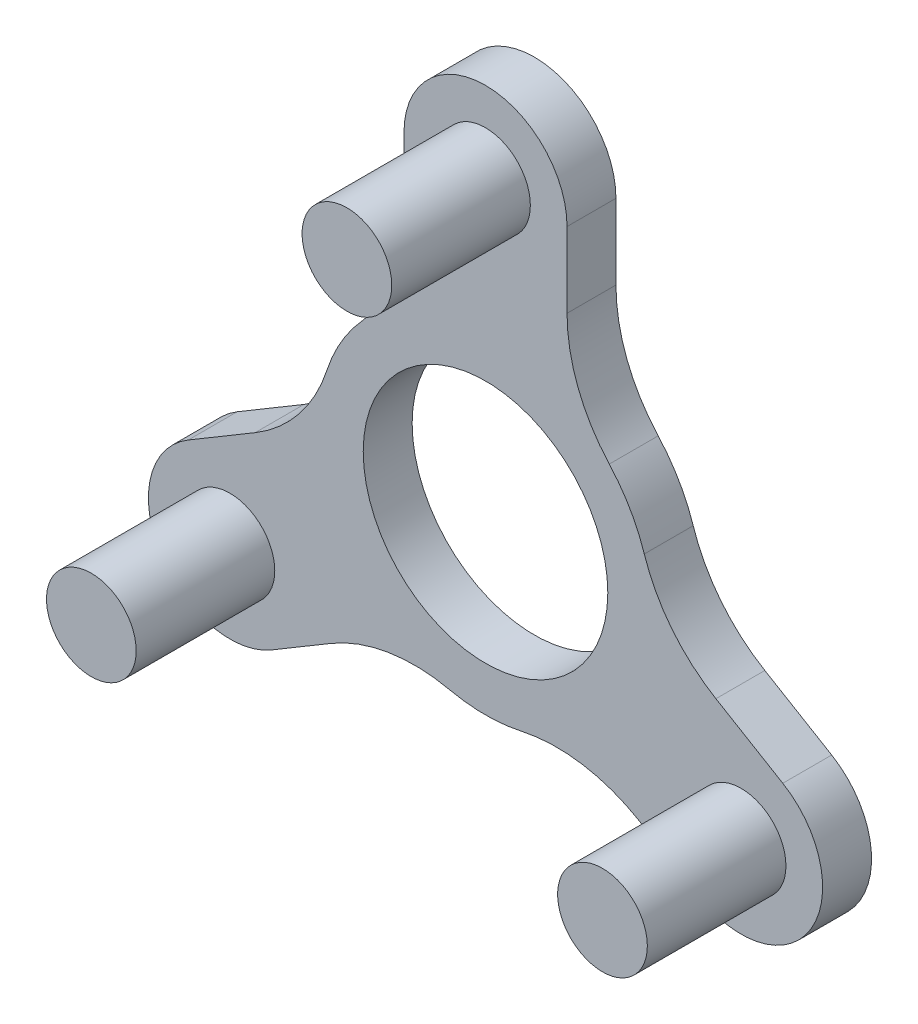
ISO-10303-21;
HEADER;
FILE_DESCRIPTION(('STEP AP214'),'2;1');
FILE_NAME('part.step','',(''),(''),'','','');
FILE_SCHEMA(('AUTOMOTIVE_DESIGN { 1 0 10303 214 1 1 1 1 }'));
ENDSEC;
DATA;
#1=APPLICATION_CONTEXT('core data for automotive mechanical design processes');
#2=APPLICATION_PROTOCOL_DEFINITION('international standard','automotive_design',2000,#1);
#3=PRODUCT_CONTEXT('',#1,'mechanical');
#4=PRODUCT('Part','Part','',(#3));
#5=PRODUCT_RELATED_PRODUCT_CATEGORY('part','',(#4));
#6=PRODUCT_DEFINITION_FORMATION('','',#4);
#7=PRODUCT_DEFINITION_CONTEXT('part definition',#1,'design');
#8=PRODUCT_DEFINITION('design','',#6,#7);
#9=PRODUCT_DEFINITION_SHAPE('','',#8);
#10=(LENGTH_UNIT() NAMED_UNIT(*) SI_UNIT(.MILLI.,.METRE.));
#11=(NAMED_UNIT(*) PLANE_ANGLE_UNIT() SI_UNIT($,.RADIAN.));
#12=(NAMED_UNIT(*) SI_UNIT($,.STERADIAN.) SOLID_ANGLE_UNIT());
#13=UNCERTAINTY_MEASURE_WITH_UNIT(LENGTH_MEASURE(1.E-05),#10,'distance_accuracy_value','');
#14=(GEOMETRIC_REPRESENTATION_CONTEXT(3) GLOBAL_UNCERTAINTY_ASSIGNED_CONTEXT((#13)) GLOBAL_UNIT_ASSIGNED_CONTEXT((#10,
#11,#12)) REPRESENTATION_CONTEXT('',''));
#15=CARTESIAN_POINT('',(0.,0.,0.));
#16=DIRECTION('',(0.,0.,1.));
#17=DIRECTION('',(1.,0.,0.));
#18=AXIS2_PLACEMENT_3D('',#15,#16,#17);
#19=CARTESIAN_POINT('',(-15.6750598084983,-9.05000000000008,3.));
#20=DIRECTION('',(0.,0.,-1.));
#21=DIRECTION('',(-1.,0.,0.));
#22=AXIS2_PLACEMENT_3D('',#19,#20,#21);
#23=CYLINDRICAL_SURFACE('',#22,5.);
#24=CARTESIAN_POINT('',(-15.6750598084983,-9.05000000000008,0.));
#25=DIRECTION('',(0.,0.,1.));
#26=DIRECTION('',(1.,0.,0.));
#27=AXIS2_PLACEMENT_3D('',#24,#25,#26);
#28=CIRCLE('',#27,5.);
#29=CARTESIAN_POINT('',(-18.2317713929619,-4.75311439832654,0.));
#30=VERTEX_POINT('',#29);
#31=CARTESIAN_POINT('',(-13.1183482240346,-13.3468856016736,0.));
#32=VERTEX_POINT('',#31);
#33=EDGE_CURVE('E255',#30,#32,#28,.T.);
#34=ORIENTED_EDGE('',*,*,#33,.T.);
#35=DIRECTION('',(0.,0.,-1.));
#36=VECTOR('',#35,1.);
#37=CARTESIAN_POINT('',(-13.1183482240346,-13.3468856016736,3.));
#38=LINE('',#37,#36);
#39=CARTESIAN_POINT('',(-13.1183482240346,-13.3468856016736,3.));
#40=VERTEX_POINT('',#39);
#41=EDGE_CURVE('E211',#40,#32,#38,.T.);
#42=ORIENTED_EDGE('',*,*,#41,.F.);
#43=CARTESIAN_POINT('',(-15.6750598084983,-9.05000000000008,3.));
#44=DIRECTION('',(0.,0.,1.));
#45=DIRECTION('',(1.,0.,0.));
#46=AXIS2_PLACEMENT_3D('',#43,#44,#45);
#47=CIRCLE('',#46,5.);
#48=CARTESIAN_POINT('',(-18.2317713929619,-4.75311439832654,3.));
#49=VERTEX_POINT('',#48);
#50=EDGE_CURVE('E214',#49,#40,#47,.T.);
#51=ORIENTED_EDGE('',*,*,#50,.F.);
#52=DIRECTION('',(0.,0.,-1.));
#53=VECTOR('',#52,1.);
#54=CARTESIAN_POINT('',(-18.2317713929619,-4.75311439832654,3.));
#55=LINE('',#54,#53);
#56=EDGE_CURVE('E199',#49,#30,#55,.T.);
#57=ORIENTED_EDGE('',*,*,#56,.T.);
#58=EDGE_LOOP('',(#34,#42,#51,#57));
#59=FACE_BOUND('',#58,.T.);
#60=ADVANCED_FACE('F74',(#59),#23,.T.);
#61=CARTESIAN_POINT('',(2.43503335375282,-4.09238954480285,3.));
#62=DIRECTION('',(-0.511342316892728,0.859377120334709,0.));
#63=DIRECTION('',(-0.859377120334709,-0.511342316892728,0.));
#64=AXIS2_PLACEMENT_3D('',#61,#62,#63);
#65=PLANE('',#64);
#66=DIRECTION('',(0.859377120334709,0.511342316892728,0.));
#67=VECTOR('',#66,1.);
#68=CARTESIAN_POINT('',(2.43503335375282,-4.09238954480285,0.));
#69=LINE('',#68,#67);
#70=CARTESIAN_POINT('',(-9.46922520496294,-11.1756025001734,0.));
#71=VERTEX_POINT('',#70);
#72=EDGE_CURVE('E258',#32,#71,#69,.T.);
#73=ORIENTED_EDGE('',*,*,#72,.T.);
#74=DIRECTION('',(0.,0.,1.));
#75=VECTOR('',#74,1.);
#76=CARTESIAN_POINT('',(-9.46922520496294,-11.1756025001734,3.));
#77=LINE('',#76,#75);
#78=CARTESIAN_POINT('',(-9.46922520496294,-11.1756025001734,3.));
#79=VERTEX_POINT('',#78);
#80=EDGE_CURVE('E89',#71,#79,#77,.T.);
#81=ORIENTED_EDGE('',*,*,#80,.T.);
#82=DIRECTION('',(0.859377120334709,0.511342316892728,0.));
#83=VECTOR('',#82,1.);
#84=CARTESIAN_POINT('',(2.43503335375282,-4.09238954480285,3.));
#85=LINE('',#84,#83);
#86=EDGE_CURVE('E217',#40,#79,#85,.T.);
#87=ORIENTED_EDGE('',*,*,#86,.F.);
#88=ORIENTED_EDGE('',*,*,#41,.T.);
#89=EDGE_LOOP('',(#73,#81,#87,#88));
#90=FACE_BOUND('',#89,.T.);
#91=ADVANCED_FACE('F353',(#90),#65,.F.);
#92=CARTESIAN_POINT('',(0.,0.,3.));
#93=DIRECTION('',(0.,0.,-1.));
#94=DIRECTION('',(-1.,0.,0.));
#95=AXIS2_PLACEMENT_3D('',#92,#93,#94);
#96=CYLINDRICAL_SURFACE('',#95,10.2435458358109);
#97=CARTESIAN_POINT('',(0.,0.,0.));
#98=DIRECTION('',(0.,0.,1.));
#99=DIRECTION('',(1.,0.,0.));
#100=AXIS2_PLACEMENT_3D('',#97,#98,#99);
#101=CIRCLE('',#100,10.2435458358109);
#102=CARTESIAN_POINT('',(-2.20410288640831,-10.0036074371442,0.));
#103=VERTEX_POINT('',#102);
#104=CARTESIAN_POINT('',(2.20410288640832,-10.0036074371442,0.));
#105=VERTEX_POINT('',#104);
#106=EDGE_CURVE('E229',#103,#105,#101,.T.);
#107=ORIENTED_EDGE('',*,*,#106,.T.);
#108=DIRECTION('',(0.,0.,-1.));
#109=VECTOR('',#108,1.);
#110=CARTESIAN_POINT('',(2.20410288640832,-10.0036074371442,3.));
#111=LINE('',#110,#109);
#112=CARTESIAN_POINT('',(2.20410288640832,-10.0036074371442,3.));
#113=VERTEX_POINT('',#112);
#114=EDGE_CURVE('E292',#105,#113,#111,.F.);
#115=ORIENTED_EDGE('',*,*,#114,.T.);
#116=CARTESIAN_POINT('',(0.,0.,3.));
#117=DIRECTION('',(0.,0.,1.));
#118=DIRECTION('',(1.,0.,0.));
#119=AXIS2_PLACEMENT_3D('',#116,#117,#118);
#120=CIRCLE('',#119,10.2435458358109);
#121=CARTESIAN_POINT('',(-2.20410288640831,-10.0036074371442,3.));
#122=VERTEX_POINT('',#121);
#123=EDGE_CURVE('E235',#122,#113,#120,.T.);
#124=ORIENTED_EDGE('',*,*,#123,.F.);
#125=DIRECTION('',(0.,0.,-1.));
#126=VECTOR('',#125,1.);
#127=CARTESIAN_POINT('',(-2.20410288640831,-10.0036074371442,3.));
#128=LINE('',#127,#126);
#129=EDGE_CURVE('E289',#122,#103,#128,.T.);
#130=ORIENTED_EDGE('',*,*,#129,.T.);
#131=EDGE_LOOP('',(#107,#115,#124,#130));
#132=FACE_BOUND('',#131,.T.);
#133=ADVANCED_FACE('F358',(#132),#96,.T.);
#134=CARTESIAN_POINT('',(-2.43503335375282,-4.09238954480286,3.));
#135=DIRECTION('',(-0.511342316892728,-0.859377120334709,0.));
#136=DIRECTION('',(0.859377120334709,-0.511342316892728,0.));
#137=AXIS2_PLACEMENT_3D('',#134,#135,#136);
#138=PLANE('',#137);
#139=DIRECTION('',(-0.859377120334709,0.511342316892728,0.));
#140=VECTOR('',#139,1.);
#141=CARTESIAN_POINT('',(-2.43503335375282,-4.09238954480286,3.));
#142=LINE('',#141,#140);
#143=CARTESIAN_POINT('',(13.1183482240346,-13.3468856016736,3.));
#144=VERTEX_POINT('',#143);
#145=CARTESIAN_POINT('',(9.46922520496294,-11.1756025001734,3.));
#146=VERTEX_POINT('',#145);
#147=EDGE_CURVE('E241',#144,#146,#142,.T.);
#148=ORIENTED_EDGE('',*,*,#147,.T.);
#149=DIRECTION('',(0.,0.,-1.));
#150=VECTOR('',#149,1.);
#151=CARTESIAN_POINT('',(9.46922520496294,-11.1756025001734,3.));
#152=LINE('',#151,#150);
#153=CARTESIAN_POINT('',(9.46922520496294,-11.1756025001734,0.));
#154=VERTEX_POINT('',#153);
#155=EDGE_CURVE('E210',#146,#154,#152,.T.);
#156=ORIENTED_EDGE('',*,*,#155,.T.);
#157=DIRECTION('',(-0.859377120334709,0.511342316892728,0.));
#158=VECTOR('',#157,1.);
#159=CARTESIAN_POINT('',(-2.43503335375282,-4.09238954480286,0.));
#160=LINE('',#159,#158);
#161=CARTESIAN_POINT('',(13.1183482240346,-13.3468856016736,0.));
#162=VERTEX_POINT('',#161);
#163=EDGE_CURVE('E260',#162,#154,#160,.T.);
#164=ORIENTED_EDGE('',*,*,#163,.F.);
#165=DIRECTION('',(0.,0.,-1.));
#166=VECTOR('',#165,1.);
#167=CARTESIAN_POINT('',(13.1183482240346,-13.3468856016736,3.));
#168=LINE('',#167,#166);
#169=EDGE_CURVE('E279',#144,#162,#168,.T.);
#170=ORIENTED_EDGE('',*,*,#169,.F.);
#171=EDGE_LOOP('',(#148,#156,#164,#170));
#172=FACE_BOUND('',#171,.T.);
#173=ADVANCED_FACE('F416',(#172),#138,.T.);
#174=CARTESIAN_POINT('',(2.67838981517445,4.50138165854423,3.));
#175=DIRECTION('',(-0.511342316892728,-0.859377120334709,0.));
#176=DIRECTION('',(0.859377120334709,-0.511342316892728,0.));
#177=AXIS2_PLACEMENT_3D('',#174,#175,#176);
#178=PLANE('',#177);
#179=DIRECTION('',(-0.859377120334709,0.511342316892728,0.));
#180=VECTOR('',#179,1.);
#181=CARTESIAN_POINT('',(2.67838981517445,4.50138165854423,0.));
#182=LINE('',#181,#180);
#183=CARTESIAN_POINT('',(18.2317713929619,-4.75311439832654,0.));
#184=VERTEX_POINT('',#183);
#185=CARTESIAN_POINT('',(14.1312068435024,-2.31321679380084,0.));
#186=VERTEX_POINT('',#185);
#187=EDGE_CURVE('E263',#184,#186,#182,.T.);
#188=ORIENTED_EDGE('',*,*,#187,.T.);
#189=DIRECTION('',(0.,0.,1.));
#190=VECTOR('',#189,1.);
#191=CARTESIAN_POINT('',(14.1312068435024,-2.31321679380084,3.));
#192=LINE('',#191,#190);
#193=CARTESIAN_POINT('',(14.1312068435024,-2.31321679380084,3.));
#194=VERTEX_POINT('',#193);
#195=EDGE_CURVE('E299',#186,#194,#192,.T.);
#196=ORIENTED_EDGE('',*,*,#195,.T.);
#197=DIRECTION('',(-0.859377120334709,0.511342316892728,0.));
#198=VECTOR('',#197,1.);
#199=CARTESIAN_POINT('',(2.67838981517445,4.50138165854423,3.));
#200=LINE('',#199,#198);
#201=CARTESIAN_POINT('',(18.2317713929619,-4.75311439832654,3.));
#202=VERTEX_POINT('',#201);
#203=EDGE_CURVE('E244',#202,#194,#200,.T.);
#204=ORIENTED_EDGE('',*,*,#203,.F.);
#205=DIRECTION('',(0.,0.,-1.));
#206=VECTOR('',#205,1.);
#207=CARTESIAN_POINT('',(18.2317713929619,-4.75311439832654,3.));
#208=LINE('',#207,#206);
#209=EDGE_CURVE('E277',#202,#184,#208,.T.);
#210=ORIENTED_EDGE('',*,*,#209,.T.);
#211=EDGE_LOOP('',(#188,#196,#204,#210));
#212=FACE_BOUND('',#211,.T.);
#213=ADVANCED_FACE('F414',(#212),#178,.F.);
#214=CARTESIAN_POINT('',(9.73807905119151,3.17805721834967,3.));
#215=VERTEX_POINT('',#214);
#216=CARTESIAN_POINT('',(7.59023092018547,6.87885352864995,3.));
#217=VERTEX_POINT('',#216);
#218=EDGE_CURVE('E240',#215,#217,#120,.T.);
#219=ORIENTED_EDGE('',*,*,#218,.F.);
#220=DIRECTION('',(0.,0.,-1.));
#221=VECTOR('',#220,1.);
#222=CARTESIAN_POINT('',(9.73807905119151,3.17805721834967,3.));
#223=LINE('',#222,#221);
#224=CARTESIAN_POINT('',(9.73807905119151,3.17805721834967,0.));
#225=VERTEX_POINT('',#224);
#226=EDGE_CURVE('E296',#215,#225,#223,.T.);
#227=ORIENTED_EDGE('',*,*,#226,.T.);
#228=CARTESIAN_POINT('',(7.59023092018547,6.87885352864995,0.));
#229=VERTEX_POINT('',#228);
#230=EDGE_CURVE('E228',#225,#229,#101,.T.);
#231=ORIENTED_EDGE('',*,*,#230,.T.);
#232=DIRECTION('',(0.,0.,-1.));
#233=VECTOR('',#232,1.);
#234=CARTESIAN_POINT('',(7.59023092018547,6.87885352864995,3.));
#235=LINE('',#234,#233);
#236=EDGE_CURVE('E294',#229,#217,#235,.F.);
#237=ORIENTED_EDGE('',*,*,#236,.T.);
#238=EDGE_LOOP('',(#219,#227,#231,#237));
#239=FACE_BOUND('',#238,.T.);
#240=ADVANCED_FACE('F408',(#239),#96,.T.);
#241=CARTESIAN_POINT('',(5.,0.,3.));
#242=DIRECTION('',(1.,0.,0.));
#243=DIRECTION('',(0.,1.,0.));
#244=AXIS2_PLACEMENT_3D('',#241,#242,#243);
#245=PLANE('',#244);
#246=DIRECTION('',(0.,-1.,0.));
#247=VECTOR('',#246,1.);
#248=CARTESIAN_POINT('',(5.,0.,3.));
#249=LINE('',#248,#247);
#250=CARTESIAN_POINT('',(5.,18.2,3.));
#251=VERTEX_POINT('',#250);
#252=CARTESIAN_POINT('',(5.,13.5941585986989,3.));
#253=VERTEX_POINT('',#252);
#254=EDGE_CURVE('E247',#251,#253,#249,.T.);
#255=ORIENTED_EDGE('',*,*,#254,.T.);
#256=DIRECTION('',(0.,0.,-1.));
#257=VECTOR('',#256,1.);
#258=CARTESIAN_POINT('',(5.,13.5941585986989,3.));
#259=LINE('',#258,#257);
#260=CARTESIAN_POINT('',(5.,13.5941585986989,0.));
#261=VERTEX_POINT('',#260);
#262=EDGE_CURVE('E301',#253,#261,#259,.T.);
#263=ORIENTED_EDGE('',*,*,#262,.T.);
#264=DIRECTION('',(0.,-1.,0.));
#265=VECTOR('',#264,1.);
#266=CARTESIAN_POINT('',(5.,0.,0.));
#267=LINE('',#266,#265);
#268=CARTESIAN_POINT('',(5.,18.2,0.));
#269=VERTEX_POINT('',#268);
#270=EDGE_CURVE('E266',#269,#261,#267,.T.);
#271=ORIENTED_EDGE('',*,*,#270,.F.);
#272=DIRECTION('',(0.,0.,-1.));
#273=VECTOR('',#272,1.);
#274=CARTESIAN_POINT('',(5.,18.2,3.));
#275=LINE('',#274,#273);
#276=EDGE_CURVE('E275',#251,#269,#275,.T.);
#277=ORIENTED_EDGE('',*,*,#276,.F.);
#278=EDGE_LOOP('',(#255,#263,#271,#277));
#279=FACE_BOUND('',#278,.T.);
#280=ADVANCED_FACE('F388',(#279),#245,.T.);
#281=CARTESIAN_POINT('',(0.,18.2,3.));
#282=DIRECTION('',(0.,0.,-1.));
#283=DIRECTION('',(-1.,0.,0.));
#284=AXIS2_PLACEMENT_3D('',#281,#282,#283);
#285=CYLINDRICAL_SURFACE('',#284,5.);
#286=CARTESIAN_POINT('',(0.,18.2,0.));
#287=DIRECTION('',(0.,0.,1.));
#288=DIRECTION('',(1.,0.,0.));
#289=AXIS2_PLACEMENT_3D('',#286,#287,#288);
#290=CIRCLE('',#289,5.);
#291=CARTESIAN_POINT('',(-5.,18.2,0.));
#292=VERTEX_POINT('',#291);
#293=EDGE_CURVE('E269',#269,#292,#290,.T.);
#294=ORIENTED_EDGE('',*,*,#293,.T.);
#295=DIRECTION('',(0.,0.,-1.));
#296=VECTOR('',#295,1.);
#297=CARTESIAN_POINT('',(-5.,18.2,3.));
#298=LINE('',#297,#296);
#299=CARTESIAN_POINT('',(-5.,18.2,3.));
#300=VERTEX_POINT('',#299);
#301=EDGE_CURVE('E238',#300,#292,#298,.T.);
#302=ORIENTED_EDGE('',*,*,#301,.F.);
#303=CARTESIAN_POINT('',(0.,18.2,3.));
#304=DIRECTION('',(0.,0.,1.));
#305=DIRECTION('',(1.,0.,0.));
#306=AXIS2_PLACEMENT_3D('',#303,#304,#305);
#307=CIRCLE('',#306,5.);
#308=EDGE_CURVE('E250',#251,#300,#307,.T.);
#309=ORIENTED_EDGE('',*,*,#308,.F.);
#310=ORIENTED_EDGE('',*,*,#276,.T.);
#311=EDGE_LOOP('',(#294,#302,#309,#310));
#312=FACE_BOUND('',#311,.T.);
#313=ADVANCED_FACE('F394',(#312),#285,.T.);
#314=CARTESIAN_POINT('',(-5.,0.,3.));
#315=DIRECTION('',(1.,0.,0.));
#316=DIRECTION('',(0.,1.,0.));
#317=AXIS2_PLACEMENT_3D('',#314,#315,#316);
#318=PLANE('',#317);
#319=DIRECTION('',(0.,-1.,0.));
#320=VECTOR('',#319,1.);
#321=CARTESIAN_POINT('',(-5.,0.,0.));
#322=LINE('',#321,#320);
#323=CARTESIAN_POINT('',(-5.,13.5941585986989,0.));
#324=VERTEX_POINT('',#323);
#325=EDGE_CURVE('E226',#292,#324,#322,.T.);
#326=ORIENTED_EDGE('',*,*,#325,.T.);
#327=DIRECTION('',(0.,0.,1.));
#328=VECTOR('',#327,1.);
#329=CARTESIAN_POINT('',(-5.,13.5941585986989,3.));
#330=LINE('',#329,#328);
#331=CARTESIAN_POINT('',(-5.,13.5941585986989,3.));
#332=VERTEX_POINT('',#331);
#333=EDGE_CURVE('E309',#324,#332,#330,.T.);
#334=ORIENTED_EDGE('',*,*,#333,.T.);
#335=DIRECTION('',(0.,-1.,0.));
#336=VECTOR('',#335,1.);
#337=CARTESIAN_POINT('',(-5.,0.,3.));
#338=LINE('',#337,#336);
#339=EDGE_CURVE('E239',#300,#332,#338,.T.);
#340=ORIENTED_EDGE('',*,*,#339,.F.);
#341=ORIENTED_EDGE('',*,*,#301,.T.);
#342=EDGE_LOOP('',(#326,#334,#340,#341));
#343=FACE_BOUND('',#342,.T.);
#344=ADVANCED_FACE('F400',(#343),#318,.F.);
#345=CARTESIAN_POINT('',(-7.59023092018547,6.87885352864995,3.));
#346=VERTEX_POINT('',#345);
#347=CARTESIAN_POINT('',(-9.73807905119151,3.17805721834968,3.));
#348=VERTEX_POINT('',#347);
#349=EDGE_CURVE('E236',#346,#348,#120,.T.);
#350=ORIENTED_EDGE('',*,*,#349,.F.);
#351=DIRECTION('',(0.,0.,-1.));
#352=VECTOR('',#351,1.);
#353=CARTESIAN_POINT('',(-7.59023092018547,6.87885352864995,3.));
#354=LINE('',#353,#352);
#355=CARTESIAN_POINT('',(-7.59023092018547,6.87885352864995,0.));
#356=VERTEX_POINT('',#355);
#357=EDGE_CURVE('E306',#346,#356,#354,.T.);
#358=ORIENTED_EDGE('',*,*,#357,.T.);
#359=CARTESIAN_POINT('',(-9.73807905119151,3.17805721834968,0.));
#360=VERTEX_POINT('',#359);
#361=EDGE_CURVE('E223',#356,#360,#101,.T.);
#362=ORIENTED_EDGE('',*,*,#361,.T.);
#363=DIRECTION('',(0.,0.,-1.));
#364=VECTOR('',#363,1.);
#365=CARTESIAN_POINT('',(-9.73807905119151,3.17805721834968,3.));
#366=LINE('',#365,#364);
#367=EDGE_CURVE('E304',#360,#348,#366,.F.);
#368=ORIENTED_EDGE('',*,*,#367,.T.);
#369=EDGE_LOOP('',(#350,#358,#362,#368));
#370=FACE_BOUND('',#369,.T.);
#371=ADVANCED_FACE('F338',(#370),#96,.T.);
#372=CARTESIAN_POINT('',(-2.67838981517446,4.50138165854424,3.));
#373=DIRECTION('',(-0.511342316892728,0.859377120334709,0.));
#374=DIRECTION('',(-0.859377120334709,-0.511342316892728,0.));
#375=AXIS2_PLACEMENT_3D('',#372,#373,#374);
#376=PLANE('',#375);
#377=DIRECTION('',(0.859377120334709,0.511342316892728,0.));
#378=VECTOR('',#377,1.);
#379=CARTESIAN_POINT('',(-2.67838981517446,4.50138165854424,3.));
#380=LINE('',#379,#378);
#381=CARTESIAN_POINT('',(-14.1312068435023,-2.31321679380083,3.));
#382=VERTEX_POINT('',#381);
#383=EDGE_CURVE('E204',#49,#382,#380,.T.);
#384=ORIENTED_EDGE('',*,*,#383,.T.);
#385=DIRECTION('',(0.,0.,-1.));
#386=VECTOR('',#385,1.);
#387=CARTESIAN_POINT('',(-14.1312068435023,-2.31321679380083,3.));
#388=LINE('',#387,#386);
#389=CARTESIAN_POINT('',(-14.1312068435023,-2.31321679380083,0.));
#390=VERTEX_POINT('',#389);
#391=EDGE_CURVE('E311',#382,#390,#388,.T.);
#392=ORIENTED_EDGE('',*,*,#391,.T.);
#393=DIRECTION('',(0.859377120334709,0.511342316892728,0.));
#394=VECTOR('',#393,1.);
#395=CARTESIAN_POINT('',(-2.67838981517446,4.50138165854424,0.));
#396=LINE('',#395,#394);
#397=EDGE_CURVE('E207',#30,#390,#396,.T.);
#398=ORIENTED_EDGE('',*,*,#397,.F.);
#399=ORIENTED_EDGE('',*,*,#56,.F.);
#400=EDGE_LOOP('',(#384,#392,#398,#399));
#401=FACE_BOUND('',#400,.T.);
#402=ADVANCED_FACE('F201',(#401),#376,.T.);
#403=CARTESIAN_POINT('',(0.,0.,0.));
#404=DIRECTION('',(0.,0.,1.));
#405=DIRECTION('',(1.,0.,0.));
#406=AXIS2_PLACEMENT_3D('',#403,#404,#405);
#407=PLANE('',#406);
#408=CARTESIAN_POINT('',(0.,0.,0.));
#409=DIRECTION('',(0.,0.,1.));
#410=DIRECTION('',(1.,0.,0.));
#411=AXIS2_PLACEMENT_3D('',#408,#409,#410);
#412=CIRCLE('',#411,7.5);
#413=CARTESIAN_POINT('',(7.5,0.,0.));
#414=VERTEX_POINT('',#413);
#415=EDGE_CURVE('E231',#414,#414,#412,.T.);
#416=ORIENTED_EDGE('',*,*,#415,.T.);
#417=EDGE_LOOP('',(#416));
#418=FACE_BOUND('',#417,.T.);
#419=ORIENTED_EDGE('',*,*,#397,.T.);
#420=CARTESIAN_POINT('',(-19.2446300124296,6.28055440954626,0.));
#421=DIRECTION('',(0.,0.,1.));
#422=DIRECTION('',(1.,0.,0.));
#423=AXIS2_PLACEMENT_3D('',#420,#421,#422);
#424=CIRCLE('',#423,10.);
#425=EDGE_CURVE('E330',#390,#360,#424,.T.);
#426=ORIENTED_EDGE('',*,*,#425,.T.);
#427=ORIENTED_EDGE('',*,*,#361,.F.);
#428=CARTESIAN_POINT('',(-15.,13.5941585986989,0.));
#429=DIRECTION('',(0.,0.,1.));
#430=DIRECTION('',(1.,0.,0.));
#431=AXIS2_PLACEMENT_3D('',#428,#429,#430);
#432=CIRCLE('',#431,10.);
#433=EDGE_CURVE('E326',#356,#324,#432,.T.);
#434=ORIENTED_EDGE('',*,*,#433,.T.);
#435=ORIENTED_EDGE('',*,*,#325,.F.);
#436=ORIENTED_EDGE('',*,*,#293,.F.);
#437=ORIENTED_EDGE('',*,*,#270,.T.);
#438=CARTESIAN_POINT('',(15.,13.5941585986989,0.));
#439=DIRECTION('',(0.,0.,1.));
#440=DIRECTION('',(1.,0.,0.));
#441=AXIS2_PLACEMENT_3D('',#438,#439,#440);
#442=CIRCLE('',#441,10.);
#443=EDGE_CURVE('E322',#261,#229,#442,.T.);
#444=ORIENTED_EDGE('',*,*,#443,.T.);
#445=ORIENTED_EDGE('',*,*,#230,.F.);
#446=CARTESIAN_POINT('',(19.2446300124296,6.28055440954625,0.));
#447=DIRECTION('',(0.,0.,1.));
#448=DIRECTION('',(1.,0.,0.));
#449=AXIS2_PLACEMENT_3D('',#446,#447,#448);
#450=CIRCLE('',#449,10.);
#451=EDGE_CURVE('E318',#225,#186,#450,.T.);
#452=ORIENTED_EDGE('',*,*,#451,.T.);
#453=ORIENTED_EDGE('',*,*,#187,.F.);
#454=CARTESIAN_POINT('',(15.6750598084983,-9.05000000000008,0.));
#455=DIRECTION('',(0.,0.,1.));
#456=DIRECTION('',(1.,0.,0.));
#457=AXIS2_PLACEMENT_3D('',#454,#455,#456);
#458=CIRCLE('',#457,5.);
#459=EDGE_CURVE('E284',#162,#184,#458,.T.);
#460=ORIENTED_EDGE('',*,*,#459,.F.);
#461=ORIENTED_EDGE('',*,*,#163,.T.);
#462=CARTESIAN_POINT('',(4.35580203603567,-19.7693737035204,0.));
#463=DIRECTION('',(0.,0.,1.));
#464=DIRECTION('',(1.,0.,0.));
#465=AXIS2_PLACEMENT_3D('',#462,#463,#464);
#466=CIRCLE('',#465,10.);
#467=EDGE_CURVE('E314',#154,#105,#466,.T.);
#468=ORIENTED_EDGE('',*,*,#467,.T.);
#469=ORIENTED_EDGE('',*,*,#106,.F.);
#470=CARTESIAN_POINT('',(-4.35580203603566,-19.7693737035204,0.));
#471=DIRECTION('',(0.,0.,1.));
#472=DIRECTION('',(1.,0.,0.));
#473=AXIS2_PLACEMENT_3D('',#470,#471,#472);
#474=CIRCLE('',#473,10.);
#475=EDGE_CURVE('E82',#103,#71,#474,.T.);
#476=ORIENTED_EDGE('',*,*,#475,.T.);
#477=ORIENTED_EDGE('',*,*,#72,.F.);
#478=ORIENTED_EDGE('',*,*,#33,.F.);
#479=EDGE_LOOP('',(#419,#426,#427,#434,#435,#436,#437,#444,#445,#452,#453,#460,#461,#468,#469,
#476,#477,#478));
#480=FACE_BOUND('',#479,.T.);
#481=ADVANCED_FACE('F333',(#418,#480),#407,.F.);
#482=CARTESIAN_POINT('',(0.,0.,3.));
#483=DIRECTION('',(0.,0.,1.));
#484=DIRECTION('',(1.,0.,0.));
#485=AXIS2_PLACEMENT_3D('',#482,#483,#484);
#486=PLANE('',#485);
#487=CARTESIAN_POINT('',(-15.6750598084983,-9.05000000000008,3.));
#488=DIRECTION('',(0.,0.,1.));
#489=DIRECTION('',(1.,0.,0.));
#490=AXIS2_PLACEMENT_3D('',#487,#488,#489);
#491=CIRCLE('',#490,2.75);
#492=CARTESIAN_POINT('',(-12.9250598084983,-9.05000000000008,3.));
#493=VERTEX_POINT('',#492);
#494=EDGE_CURVE('E629',#493,#493,#491,.T.);
#495=ORIENTED_EDGE('',*,*,#494,.F.);
#496=EDGE_LOOP('',(#495));
#497=FACE_BOUND('',#496,.T.);
#498=CARTESIAN_POINT('',(15.6750598084983,-9.05000000000008,3.));
#499=DIRECTION('',(0.,0.,1.));
#500=DIRECTION('',(1.,0.,0.));
#501=AXIS2_PLACEMENT_3D('',#498,#499,#500);
#502=CIRCLE('',#501,2.75);
#503=CARTESIAN_POINT('',(18.4250598084983,-9.05000000000008,3.));
#504=VERTEX_POINT('',#503);
#505=EDGE_CURVE('E623',#504,#504,#502,.T.);
#506=ORIENTED_EDGE('',*,*,#505,.F.);
#507=EDGE_LOOP('',(#506));
#508=FACE_BOUND('',#507,.T.);
#509=CARTESIAN_POINT('',(0.,18.2,3.));
#510=DIRECTION('',(0.,0.,1.));
#511=DIRECTION('',(1.,0.,0.));
#512=AXIS2_PLACEMENT_3D('',#509,#510,#511);
#513=CIRCLE('',#512,2.75);
#514=CARTESIAN_POINT('',(2.75,18.2,3.));
#515=VERTEX_POINT('',#514);
#516=EDGE_CURVE('E617',#515,#515,#513,.T.);
#517=ORIENTED_EDGE('',*,*,#516,.F.);
#518=EDGE_LOOP('',(#517));
#519=FACE_BOUND('',#518,.T.);
#520=CARTESIAN_POINT('',(0.,0.,3.));
#521=DIRECTION('',(0.,0.,1.));
#522=DIRECTION('',(1.,0.,0.));
#523=AXIS2_PLACEMENT_3D('',#520,#521,#522);
#524=CIRCLE('',#523,7.5);
#525=CARTESIAN_POINT('',(7.5,0.,3.));
#526=VERTEX_POINT('',#525);
#527=EDGE_CURVE('E612',#526,#526,#524,.T.);
#528=ORIENTED_EDGE('',*,*,#527,.F.);
#529=EDGE_LOOP('',(#528));
#530=FACE_BOUND('',#529,.T.);
#531=ORIENTED_EDGE('',*,*,#383,.F.);
#532=ORIENTED_EDGE('',*,*,#50,.T.);
#533=ORIENTED_EDGE('',*,*,#86,.T.);
#534=CARTESIAN_POINT('',(-4.35580203603566,-19.7693737035204,3.));
#535=DIRECTION('',(0.,0.,1.));
#536=DIRECTION('',(1.,0.,0.));
#537=AXIS2_PLACEMENT_3D('',#534,#535,#536);
#538=CIRCLE('',#537,10.);
#539=EDGE_CURVE('E12',#79,#122,#538,.F.);
#540=ORIENTED_EDGE('',*,*,#539,.T.);
#541=ORIENTED_EDGE('',*,*,#123,.T.);
#542=CARTESIAN_POINT('',(4.35580203603567,-19.7693737035204,3.));
#543=DIRECTION('',(0.,0.,1.));
#544=DIRECTION('',(1.,0.,0.));
#545=AXIS2_PLACEMENT_3D('',#542,#543,#544);
#546=CIRCLE('',#545,10.);
#547=EDGE_CURVE('E316',#113,#146,#546,.F.);
#548=ORIENTED_EDGE('',*,*,#547,.T.);
#549=ORIENTED_EDGE('',*,*,#147,.F.);
#550=CARTESIAN_POINT('',(15.6750598084983,-9.05000000000008,3.));
#551=DIRECTION('',(0.,0.,1.));
#552=DIRECTION('',(1.,0.,0.));
#553=AXIS2_PLACEMENT_3D('',#550,#551,#552);
#554=CIRCLE('',#553,5.);
#555=EDGE_CURVE('E256',#144,#202,#554,.T.);
#556=ORIENTED_EDGE('',*,*,#555,.T.);
#557=ORIENTED_EDGE('',*,*,#203,.T.);
#558=CARTESIAN_POINT('',(19.2446300124296,6.28055440954625,3.));
#559=DIRECTION('',(0.,0.,1.));
#560=DIRECTION('',(1.,0.,0.));
#561=AXIS2_PLACEMENT_3D('',#558,#559,#560);
#562=CIRCLE('',#561,10.);
#563=EDGE_CURVE('E320',#194,#215,#562,.F.);
#564=ORIENTED_EDGE('',*,*,#563,.T.);
#565=ORIENTED_EDGE('',*,*,#218,.T.);
#566=CARTESIAN_POINT('',(15.,13.5941585986989,3.));
#567=DIRECTION('',(0.,0.,1.));
#568=DIRECTION('',(1.,0.,0.));
#569=AXIS2_PLACEMENT_3D('',#566,#567,#568);
#570=CIRCLE('',#569,10.);
#571=EDGE_CURVE('E324',#217,#253,#570,.F.);
#572=ORIENTED_EDGE('',*,*,#571,.T.);
#573=ORIENTED_EDGE('',*,*,#254,.F.);
#574=ORIENTED_EDGE('',*,*,#308,.T.);
#575=ORIENTED_EDGE('',*,*,#339,.T.);
#576=CARTESIAN_POINT('',(-15.,13.5941585986989,3.));
#577=DIRECTION('',(0.,0.,1.));
#578=DIRECTION('',(1.,0.,0.));
#579=AXIS2_PLACEMENT_3D('',#576,#577,#578);
#580=CIRCLE('',#579,10.);
#581=EDGE_CURVE('E328',#332,#346,#580,.F.);
#582=ORIENTED_EDGE('',*,*,#581,.T.);
#583=ORIENTED_EDGE('',*,*,#349,.T.);
#584=CARTESIAN_POINT('',(-19.2446300124296,6.28055440954626,3.));
#585=DIRECTION('',(0.,0.,1.));
#586=DIRECTION('',(1.,0.,0.));
#587=AXIS2_PLACEMENT_3D('',#584,#585,#586);
#588=CIRCLE('',#587,10.);
#589=EDGE_CURVE('E222',#348,#382,#588,.F.);
#590=ORIENTED_EDGE('',*,*,#589,.T.);
#591=EDGE_LOOP('',(#531,#532,#533,#540,#541,#548,#549,#556,#557,#564,#565,#572,#573,#574,#575,
#582,#583,#590));
#592=FACE_BOUND('',#591,.T.);
#593=ADVANCED_FACE('F219',(#497,#508,#519,#530,#592),#486,.T.);
#594=CARTESIAN_POINT('',(15.6750598084983,-9.05000000000008,3.));
#595=DIRECTION('',(0.,0.,-1.));
#596=DIRECTION('',(-1.,0.,0.));
#597=AXIS2_PLACEMENT_3D('',#594,#595,#596);
#598=CYLINDRICAL_SURFACE('',#597,5.);
#599=ORIENTED_EDGE('',*,*,#169,.T.);
#600=ORIENTED_EDGE('',*,*,#459,.T.);
#601=ORIENTED_EDGE('',*,*,#209,.F.);
#602=ORIENTED_EDGE('',*,*,#555,.F.);
#603=EDGE_LOOP('',(#599,#600,#601,#602));
#604=FACE_BOUND('',#603,.T.);
#605=ADVANCED_FACE('F364',(#604),#598,.T.);
#606=CARTESIAN_POINT('',(0.,0.,-7.));
#607=DIRECTION('',(0.,0.,1.));
#608=DIRECTION('',(1.,0.,0.));
#609=AXIS2_PLACEMENT_3D('',#606,#607,#608);
#610=CYLINDRICAL_SURFACE('',#609,7.5);
#611=ORIENTED_EDGE('',*,*,#527,.T.);
#612=EDGE_LOOP('',(#611));
#613=FACE_BOUND('',#612,.T.);
#614=ORIENTED_EDGE('',*,*,#415,.F.);
#615=EDGE_LOOP('',(#614));
#616=FACE_BOUND('',#615,.T.);
#617=ADVANCED_FACE('F367',(#613,#616),#610,.F.);
#618=CARTESIAN_POINT('',(4.35580203603567,-19.7693737035204,3.));
#619=DIRECTION('',(0.,0.,-1.));
#620=DIRECTION('',(-1.,0.,0.));
#621=AXIS2_PLACEMENT_3D('',#618,#619,#620);
#622=CYLINDRICAL_SURFACE('',#621,10.);
#623=ORIENTED_EDGE('',*,*,#547,.F.);
#624=ORIENTED_EDGE('',*,*,#114,.F.);
#625=ORIENTED_EDGE('',*,*,#467,.F.);
#626=ORIENTED_EDGE('',*,*,#155,.F.);
#627=EDGE_LOOP('',(#623,#624,#625,#626));
#628=FACE_BOUND('',#627,.T.);
#629=ADVANCED_FACE('F369',(#628),#622,.F.);
#630=CARTESIAN_POINT('',(19.2446300124296,6.28055440954625,3.));
#631=DIRECTION('',(0.,0.,-1.));
#632=DIRECTION('',(-1.,0.,0.));
#633=AXIS2_PLACEMENT_3D('',#630,#631,#632);
#634=CYLINDRICAL_SURFACE('',#633,10.);
#635=ORIENTED_EDGE('',*,*,#563,.F.);
#636=ORIENTED_EDGE('',*,*,#195,.F.);
#637=ORIENTED_EDGE('',*,*,#451,.F.);
#638=ORIENTED_EDGE('',*,*,#226,.F.);
#639=EDGE_LOOP('',(#635,#636,#637,#638));
#640=FACE_BOUND('',#639,.T.);
#641=ADVANCED_FACE('F372',(#640),#634,.F.);
#642=CARTESIAN_POINT('',(15.,13.5941585986989,3.));
#643=DIRECTION('',(0.,0.,-1.));
#644=DIRECTION('',(-1.,0.,0.));
#645=AXIS2_PLACEMENT_3D('',#642,#643,#644);
#646=CYLINDRICAL_SURFACE('',#645,10.);
#647=ORIENTED_EDGE('',*,*,#571,.F.);
#648=ORIENTED_EDGE('',*,*,#236,.F.);
#649=ORIENTED_EDGE('',*,*,#443,.F.);
#650=ORIENTED_EDGE('',*,*,#262,.F.);
#651=EDGE_LOOP('',(#647,#648,#649,#650));
#652=FACE_BOUND('',#651,.T.);
#653=ADVANCED_FACE('F349',(#652),#646,.F.);
#654=CARTESIAN_POINT('',(-15.,13.5941585986989,3.));
#655=DIRECTION('',(0.,0.,-1.));
#656=DIRECTION('',(-1.,0.,0.));
#657=AXIS2_PLACEMENT_3D('',#654,#655,#656);
#658=CYLINDRICAL_SURFACE('',#657,10.);
#659=ORIENTED_EDGE('',*,*,#581,.F.);
#660=ORIENTED_EDGE('',*,*,#333,.F.);
#661=ORIENTED_EDGE('',*,*,#433,.F.);
#662=ORIENTED_EDGE('',*,*,#357,.F.);
#663=EDGE_LOOP('',(#659,#660,#661,#662));
#664=FACE_BOUND('',#663,.T.);
#665=ADVANCED_FACE('F342',(#664),#658,.F.);
#666=CARTESIAN_POINT('',(-19.2446300124296,6.28055440954626,3.));
#667=DIRECTION('',(0.,0.,-1.));
#668=DIRECTION('',(-1.,0.,0.));
#669=AXIS2_PLACEMENT_3D('',#666,#667,#668);
#670=CYLINDRICAL_SURFACE('',#669,10.);
#671=ORIENTED_EDGE('',*,*,#589,.F.);
#672=ORIENTED_EDGE('',*,*,#367,.F.);
#673=ORIENTED_EDGE('',*,*,#425,.F.);
#674=ORIENTED_EDGE('',*,*,#391,.F.);
#675=EDGE_LOOP('',(#671,#672,#673,#674));
#676=FACE_BOUND('',#675,.T.);
#677=ADVANCED_FACE('F340',(#676),#670,.F.);
#678=CARTESIAN_POINT('',(-4.35580203603566,-19.7693737035204,3.));
#679=DIRECTION('',(0.,0.,-1.));
#680=DIRECTION('',(-1.,0.,0.));
#681=AXIS2_PLACEMENT_3D('',#678,#679,#680);
#682=CYLINDRICAL_SURFACE('',#681,10.);
#683=ORIENTED_EDGE('',*,*,#539,.F.);
#684=ORIENTED_EDGE('',*,*,#80,.F.);
#685=ORIENTED_EDGE('',*,*,#475,.F.);
#686=ORIENTED_EDGE('',*,*,#129,.F.);
#687=EDGE_LOOP('',(#683,#684,#685,#686));
#688=FACE_BOUND('',#687,.T.);
#689=ADVANCED_FACE('F76',(#688),#682,.F.);
#690=CARTESIAN_POINT('',(0.,18.2,11.5));
#691=DIRECTION('',(0.,0.,-1.));
#692=DIRECTION('',(-1.,0.,0.));
#693=AXIS2_PLACEMENT_3D('',#690,#691,#692);
#694=CYLINDRICAL_SURFACE('',#693,2.75);
#695=CARTESIAN_POINT('',(0.,18.2,11.5));
#696=DIRECTION('',(0.,0.,1.));
#697=DIRECTION('',(1.,0.,0.));
#698=AXIS2_PLACEMENT_3D('',#695,#696,#697);
#699=CIRCLE('',#698,2.75);
#700=CARTESIAN_POINT('',(2.75,18.2,11.5));
#701=VERTEX_POINT('',#700);
#702=EDGE_CURVE('E614',#701,#701,#699,.T.);
#703=ORIENTED_EDGE('',*,*,#702,.F.);
#704=EDGE_LOOP('',(#703));
#705=FACE_BOUND('',#704,.T.);
#706=ORIENTED_EDGE('',*,*,#516,.T.);
#707=EDGE_LOOP('',(#706));
#708=FACE_BOUND('',#707,.T.);
#709=ADVANCED_FACE('F347',(#705,#708),#694,.T.);
#710=CARTESIAN_POINT('',(0.,18.2,11.5));
#711=DIRECTION('',(0.,0.,1.));
#712=DIRECTION('',(1.,0.,0.));
#713=AXIS2_PLACEMENT_3D('',#710,#711,#712);
#714=PLANE('',#713);
#715=ORIENTED_EDGE('',*,*,#702,.T.);
#716=EDGE_LOOP('',(#715));
#717=FACE_BOUND('',#716,.T.);
#718=ADVANCED_FACE('F552',(#717),#714,.T.);
#719=CARTESIAN_POINT('',(15.6750598084983,-9.05000000000008,11.5));
#720=DIRECTION('',(0.,0.,-1.));
#721=DIRECTION('',(-1.,0.,0.));
#722=AXIS2_PLACEMENT_3D('',#719,#720,#721);
#723=CYLINDRICAL_SURFACE('',#722,2.75);
#724=CARTESIAN_POINT('',(15.6750598084983,-9.05000000000008,11.5));
#725=DIRECTION('',(0.,0.,1.));
#726=DIRECTION('',(1.,0.,0.));
#727=AXIS2_PLACEMENT_3D('',#724,#725,#726);
#728=CIRCLE('',#727,2.75);
#729=CARTESIAN_POINT('',(18.4250598084983,-9.05000000000008,11.5));
#730=VERTEX_POINT('',#729);
#731=EDGE_CURVE('E621',#730,#730,#728,.T.);
#732=ORIENTED_EDGE('',*,*,#731,.F.);
#733=EDGE_LOOP('',(#732));
#734=FACE_BOUND('',#733,.T.);
#735=ORIENTED_EDGE('',*,*,#505,.T.);
#736=EDGE_LOOP('',(#735));
#737=FACE_BOUND('',#736,.T.);
#738=ADVANCED_FACE('F562',(#734,#737),#723,.T.);
#739=CARTESIAN_POINT('',(15.6750598084983,-9.05000000000008,11.5));
#740=DIRECTION('',(0.,0.,1.));
#741=DIRECTION('',(1.,0.,0.));
#742=AXIS2_PLACEMENT_3D('',#739,#740,#741);
#743=PLANE('',#742);
#744=ORIENTED_EDGE('',*,*,#731,.T.);
#745=EDGE_LOOP('',(#744));
#746=FACE_BOUND('',#745,.T.);
#747=ADVANCED_FACE('F572',(#746),#743,.T.);
#748=CARTESIAN_POINT('',(-15.6750598084983,-9.05000000000008,11.5));
#749=DIRECTION('',(0.,0.,-1.));
#750=DIRECTION('',(-1.,0.,0.));
#751=AXIS2_PLACEMENT_3D('',#748,#749,#750);
#752=CYLINDRICAL_SURFACE('',#751,2.75);
#753=CARTESIAN_POINT('',(-15.6750598084983,-9.05000000000008,11.5));
#754=DIRECTION('',(0.,0.,1.));
#755=DIRECTION('',(1.,0.,0.));
#756=AXIS2_PLACEMENT_3D('',#753,#754,#755);
#757=CIRCLE('',#756,2.75);
#758=CARTESIAN_POINT('',(-12.9250598084983,-9.05000000000008,11.5));
#759=VERTEX_POINT('',#758);
#760=EDGE_CURVE('E626',#759,#759,#757,.T.);
#761=ORIENTED_EDGE('',*,*,#760,.F.);
#762=EDGE_LOOP('',(#761));
#763=FACE_BOUND('',#762,.T.);
#764=ORIENTED_EDGE('',*,*,#494,.T.);
#765=EDGE_LOOP('',(#764));
#766=FACE_BOUND('',#765,.T.);
#767=ADVANCED_FACE('F582',(#763,#766),#752,.T.);
#768=CARTESIAN_POINT('',(-15.6750598084983,-9.05000000000008,11.5));
#769=DIRECTION('',(0.,0.,1.));
#770=DIRECTION('',(1.,0.,0.));
#771=AXIS2_PLACEMENT_3D('',#768,#769,#770);
#772=PLANE('',#771);
#773=ORIENTED_EDGE('',*,*,#760,.T.);
#774=EDGE_LOOP('',(#773));
#775=FACE_BOUND('',#774,.T.);
#776=ADVANCED_FACE('F592',(#775),#772,.T.);
#777=CLOSED_SHELL('',(#60,#91,#133,#173,#213,#240,#280,#313,#344,#371,#402,#481,#593,#605,#617,
#629,#641,#653,#665,#677,#689,#709,#718,#738,#747,#767,#776));
#778=MANIFOLD_SOLID_BREP('B2',#777);
#779=ADVANCED_BREP_SHAPE_REPRESENTATION('',(#18,#778),#14);
#780=SHAPE_DEFINITION_REPRESENTATION(#9,#779);
ENDSEC;
END-ISO-10303-21;
